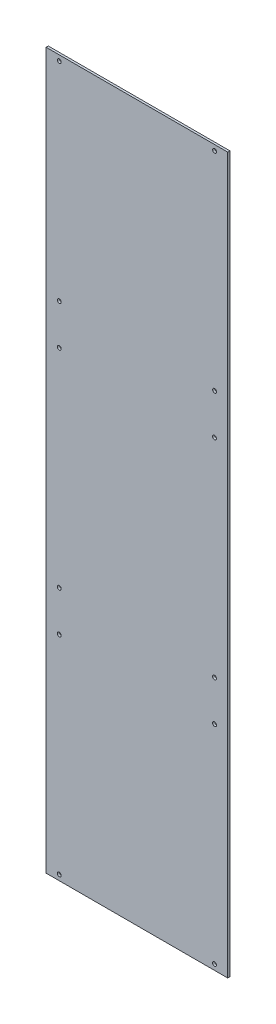
ISO-10303-21;
HEADER;
FILE_DESCRIPTION(('STEP AP214'),'2;1');
FILE_NAME('part.step','',(''),(''),'','','');
FILE_SCHEMA(('AUTOMOTIVE_DESIGN { 1 0 10303 214 1 1 1 1 }'));
ENDSEC;
DATA;
#1=APPLICATION_CONTEXT('core data for automotive mechanical design processes');
#2=APPLICATION_PROTOCOL_DEFINITION('international standard','automotive_design',2000,#1);
#3=PRODUCT_CONTEXT('',#1,'mechanical');
#4=PRODUCT('Part','Part','',(#3));
#5=PRODUCT_RELATED_PRODUCT_CATEGORY('part','',(#4));
#6=PRODUCT_DEFINITION_FORMATION('','',#4);
#7=PRODUCT_DEFINITION_CONTEXT('part definition',#1,'design');
#8=PRODUCT_DEFINITION('design','',#6,#7);
#9=PRODUCT_DEFINITION_SHAPE('','',#8);
#10=(LENGTH_UNIT() NAMED_UNIT(*) SI_UNIT(.MILLI.,.METRE.));
#11=(NAMED_UNIT(*) PLANE_ANGLE_UNIT() SI_UNIT($,.RADIAN.));
#12=(NAMED_UNIT(*) SI_UNIT($,.STERADIAN.) SOLID_ANGLE_UNIT());
#13=UNCERTAINTY_MEASURE_WITH_UNIT(LENGTH_MEASURE(1.E-05),#10,'distance_accuracy_value','');
#14=(GEOMETRIC_REPRESENTATION_CONTEXT(3) GLOBAL_UNCERTAINTY_ASSIGNED_CONTEXT((#13)) GLOBAL_UNIT_ASSIGNED_CONTEXT((#10,
#11,#12)) REPRESENTATION_CONTEXT('',''));
#15=CARTESIAN_POINT('',(0.,0.,0.));
#16=DIRECTION('',(0.,0.,1.));
#17=DIRECTION('',(1.,0.,0.));
#18=AXIS2_PLACEMENT_3D('',#15,#16,#17);
#19=CARTESIAN_POINT('',(41.5,-163.5,0.5));
#20=DIRECTION('',(-1.,0.,0.));
#21=DIRECTION('',(0.,0.,1.));
#22=AXIS2_PLACEMENT_3D('',#19,#20,#21);
#23=PLANE('',#22);
#24=DIRECTION('',(0.,1.,0.));
#25=VECTOR('',#24,1.);
#26=CARTESIAN_POINT('',(41.5,-163.5,-0.5));
#27=LINE('',#26,#25);
#28=CARTESIAN_POINT('',(41.5,-163.5,-0.5));
#29=VERTEX_POINT('',#28);
#30=CARTESIAN_POINT('',(41.5,163.5,-0.5));
#31=VERTEX_POINT('',#30);
#32=EDGE_CURVE('E95',#29,#31,#27,.T.);
#33=ORIENTED_EDGE('',*,*,#32,.T.);
#34=DIRECTION('',(0.,0.,-1.));
#35=VECTOR('',#34,1.);
#36=CARTESIAN_POINT('',(41.5,163.5,0.5));
#37=LINE('',#36,#35);
#38=CARTESIAN_POINT('',(41.5,163.5,0.5));
#39=VERTEX_POINT('',#38);
#40=EDGE_CURVE('E11',#39,#31,#37,.T.);
#41=ORIENTED_EDGE('',*,*,#40,.F.);
#42=DIRECTION('',(0.,1.,0.));
#43=VECTOR('',#42,1.);
#44=CARTESIAN_POINT('',(41.5,-163.5,0.5));
#45=LINE('',#44,#43);
#46=CARTESIAN_POINT('',(41.5,-163.5,0.5));
#47=VERTEX_POINT('',#46);
#48=EDGE_CURVE('E83',#47,#39,#45,.T.);
#49=ORIENTED_EDGE('',*,*,#48,.F.);
#50=DIRECTION('',(0.,0.,-1.));
#51=VECTOR('',#50,1.);
#52=CARTESIAN_POINT('',(41.5,-163.5,0.5));
#53=LINE('',#52,#51);
#54=EDGE_CURVE('E91',#47,#29,#53,.T.);
#55=ORIENTED_EDGE('',*,*,#54,.T.);
#56=EDGE_LOOP('',(#33,#41,#49,#55));
#57=FACE_BOUND('',#56,.T.);
#58=ADVANCED_FACE('F32',(#57),#23,.F.);
#59=CARTESIAN_POINT('',(-41.5,163.5,0.5));
#60=DIRECTION('',(0.,-1.,0.));
#61=DIRECTION('',(0.,0.,-1.));
#62=AXIS2_PLACEMENT_3D('',#59,#60,#61);
#63=PLANE('',#62);
#64=DIRECTION('',(-1.,0.,0.));
#65=VECTOR('',#64,1.);
#66=CARTESIAN_POINT('',(-41.5,163.5,-0.5));
#67=LINE('',#66,#65);
#68=CARTESIAN_POINT('',(-41.5,163.5,-0.5));
#69=VERTEX_POINT('',#68);
#70=EDGE_CURVE('E87',#31,#69,#67,.T.);
#71=ORIENTED_EDGE('',*,*,#70,.T.);
#72=DIRECTION('',(0.,0.,-1.));
#73=VECTOR('',#72,1.);
#74=CARTESIAN_POINT('',(-41.5,163.5,0.5));
#75=LINE('',#74,#73);
#76=CARTESIAN_POINT('',(-41.5,163.5,0.5));
#77=VERTEX_POINT('',#76);
#78=EDGE_CURVE('E40',#77,#69,#75,.T.);
#79=ORIENTED_EDGE('',*,*,#78,.F.);
#80=DIRECTION('',(-1.,0.,0.));
#81=VECTOR('',#80,1.);
#82=CARTESIAN_POINT('',(-41.5,163.5,0.5));
#83=LINE('',#82,#81);
#84=EDGE_CURVE('E78',#39,#77,#83,.T.);
#85=ORIENTED_EDGE('',*,*,#84,.F.);
#86=ORIENTED_EDGE('',*,*,#40,.T.);
#87=EDGE_LOOP('',(#71,#79,#85,#86));
#88=FACE_BOUND('',#87,.T.);
#89=ADVANCED_FACE('F86',(#88),#63,.F.);
#90=CARTESIAN_POINT('',(-41.5,-163.5,0.5));
#91=DIRECTION('',(1.,0.,0.));
#92=DIRECTION('',(0.,0.,-1.));
#93=AXIS2_PLACEMENT_3D('',#90,#91,#92);
#94=PLANE('',#93);
#95=DIRECTION('',(0.,-1.,0.));
#96=VECTOR('',#95,1.);
#97=CARTESIAN_POINT('',(-41.5,-163.5,-0.5));
#98=LINE('',#97,#96);
#99=CARTESIAN_POINT('',(-41.5,-163.5,-0.5));
#100=VERTEX_POINT('',#99);
#101=EDGE_CURVE('E65',#69,#100,#98,.T.);
#102=ORIENTED_EDGE('',*,*,#101,.T.);
#103=DIRECTION('',(0.,0.,-1.));
#104=VECTOR('',#103,1.);
#105=CARTESIAN_POINT('',(-41.5,-163.5,0.5));
#106=LINE('',#105,#104);
#107=CARTESIAN_POINT('',(-41.5,-163.5,0.5));
#108=VERTEX_POINT('',#107);
#109=EDGE_CURVE('E88',#108,#100,#106,.T.);
#110=ORIENTED_EDGE('',*,*,#109,.F.);
#111=DIRECTION('',(0.,-1.,0.));
#112=VECTOR('',#111,1.);
#113=CARTESIAN_POINT('',(-41.5,-163.5,0.5));
#114=LINE('',#113,#112);
#115=EDGE_CURVE('E81',#77,#108,#114,.T.);
#116=ORIENTED_EDGE('',*,*,#115,.F.);
#117=ORIENTED_EDGE('',*,*,#78,.T.);
#118=EDGE_LOOP('',(#102,#110,#116,#117));
#119=FACE_BOUND('',#118,.T.);
#120=ADVANCED_FACE('F89',(#119),#94,.F.);
#121=CARTESIAN_POINT('',(-41.5,-163.5,0.5));
#122=DIRECTION('',(0.,1.,0.));
#123=DIRECTION('',(0.,0.,1.));
#124=AXIS2_PLACEMENT_3D('',#121,#122,#123);
#125=PLANE('',#124);
#126=DIRECTION('',(1.,0.,0.));
#127=VECTOR('',#126,1.);
#128=CARTESIAN_POINT('',(-41.5,-163.5,-0.5));
#129=LINE('',#128,#127);
#130=EDGE_CURVE('E71',#100,#29,#129,.T.);
#131=ORIENTED_EDGE('',*,*,#130,.T.);
#132=ORIENTED_EDGE('',*,*,#54,.F.);
#133=DIRECTION('',(1.,0.,0.));
#134=VECTOR('',#133,1.);
#135=CARTESIAN_POINT('',(-41.5,-163.5,0.5));
#136=LINE('',#135,#134);
#137=EDGE_CURVE('E48',#108,#47,#136,.T.);
#138=ORIENTED_EDGE('',*,*,#137,.F.);
#139=ORIENTED_EDGE('',*,*,#109,.T.);
#140=EDGE_LOOP('',(#131,#132,#138,#139));
#141=FACE_BOUND('',#140,.T.);
#142=ADVANCED_FACE('F103',(#141),#125,.F.);
#143=CARTESIAN_POINT('',(0.,0.,0.5));
#144=DIRECTION('',(0.,0.,-1.));
#145=DIRECTION('',(-1.,0.,0.));
#146=AXIS2_PLACEMENT_3D('',#143,#144,#145);
#147=PLANE('',#146);
#148=CARTESIAN_POINT('',(-35.5,161.,0.500000000000001));
#149=DIRECTION('',(0.,0.,1.));
#150=DIRECTION('',(1.,0.,0.));
#151=AXIS2_PLACEMENT_3D('',#148,#149,#150);
#152=CIRCLE('',#151,0.899999999999991);
#153=CARTESIAN_POINT('',(-34.6,161.,0.500000000000001));
#154=VERTEX_POINT('',#153);
#155=EDGE_CURVE('E177',#154,#154,#152,.T.);
#156=ORIENTED_EDGE('',*,*,#155,.F.);
#157=EDGE_LOOP('',(#156));
#158=FACE_BOUND('',#157,.T.);
#159=CARTESIAN_POINT('',(35.5,161.,0.500000000000001));
#160=DIRECTION('',(0.,0.,1.));
#161=DIRECTION('',(1.,0.,0.));
#162=AXIS2_PLACEMENT_3D('',#159,#160,#161);
#163=CIRCLE('',#162,0.899999999999984);
#164=CARTESIAN_POINT('',(36.4,161.,0.500000000000001));
#165=VERTEX_POINT('',#164);
#166=EDGE_CURVE('E171',#165,#165,#163,.T.);
#167=ORIENTED_EDGE('',*,*,#166,.F.);
#168=EDGE_LOOP('',(#167));
#169=FACE_BOUND('',#168,.T.);
#170=CARTESIAN_POINT('',(-35.5,66.,0.500000000000001));
#171=DIRECTION('',(0.,0.,1.));
#172=DIRECTION('',(1.,0.,0.));
#173=AXIS2_PLACEMENT_3D('',#170,#171,#172);
#174=CIRCLE('',#173,0.899999999999991);
#175=CARTESIAN_POINT('',(-34.6,66.,0.500000000000001));
#176=VERTEX_POINT('',#175);
#177=EDGE_CURVE('E165',#176,#176,#174,.T.);
#178=ORIENTED_EDGE('',*,*,#177,.F.);
#179=EDGE_LOOP('',(#178));
#180=FACE_BOUND('',#179,.T.);
#181=CARTESIAN_POINT('',(35.5,66.,0.500000000000001));
#182=DIRECTION('',(0.,0.,1.));
#183=DIRECTION('',(1.,0.,0.));
#184=AXIS2_PLACEMENT_3D('',#181,#182,#183);
#185=CIRCLE('',#184,0.899999999999984);
#186=CARTESIAN_POINT('',(36.4,66.,0.500000000000001));
#187=VERTEX_POINT('',#186);
#188=EDGE_CURVE('E159',#187,#187,#185,.T.);
#189=ORIENTED_EDGE('',*,*,#188,.F.);
#190=EDGE_LOOP('',(#189));
#191=FACE_BOUND('',#190,.T.);
#192=CARTESIAN_POINT('',(-35.5,47.5,0.500000000000001));
#193=DIRECTION('',(0.,0.,1.));
#194=DIRECTION('',(1.,0.,0.));
#195=AXIS2_PLACEMENT_3D('',#192,#193,#194);
#196=CIRCLE('',#195,0.899999999999991);
#197=CARTESIAN_POINT('',(-34.6,47.5,0.500000000000001));
#198=VERTEX_POINT('',#197);
#199=EDGE_CURVE('E153',#198,#198,#196,.T.);
#200=ORIENTED_EDGE('',*,*,#199,.F.);
#201=EDGE_LOOP('',(#200));
#202=FACE_BOUND('',#201,.T.);
#203=CARTESIAN_POINT('',(35.5,47.5,0.500000000000001));
#204=DIRECTION('',(0.,0.,1.));
#205=DIRECTION('',(1.,0.,0.));
#206=AXIS2_PLACEMENT_3D('',#203,#204,#205);
#207=CIRCLE('',#206,0.899999999999984);
#208=CARTESIAN_POINT('',(36.4,47.5,0.500000000000001));
#209=VERTEX_POINT('',#208);
#210=EDGE_CURVE('E147',#209,#209,#207,.T.);
#211=ORIENTED_EDGE('',*,*,#210,.F.);
#212=EDGE_LOOP('',(#211));
#213=FACE_BOUND('',#212,.T.);
#214=CARTESIAN_POINT('',(-35.5,-47.5,0.500000000000001));
#215=DIRECTION('',(0.,0.,1.));
#216=DIRECTION('',(1.,0.,0.));
#217=AXIS2_PLACEMENT_3D('',#214,#215,#216);
#218=CIRCLE('',#217,0.899999999999991);
#219=CARTESIAN_POINT('',(-34.6,-47.5,0.500000000000001));
#220=VERTEX_POINT('',#219);
#221=EDGE_CURVE('E141',#220,#220,#218,.T.);
#222=ORIENTED_EDGE('',*,*,#221,.F.);
#223=EDGE_LOOP('',(#222));
#224=FACE_BOUND('',#223,.T.);
#225=CARTESIAN_POINT('',(35.5,-47.5,0.500000000000001));
#226=DIRECTION('',(0.,0.,1.));
#227=DIRECTION('',(1.,0.,0.));
#228=AXIS2_PLACEMENT_3D('',#225,#226,#227);
#229=CIRCLE('',#228,0.899999999999984);
#230=CARTESIAN_POINT('',(36.4,-47.5,0.500000000000001));
#231=VERTEX_POINT('',#230);
#232=EDGE_CURVE('E135',#231,#231,#229,.T.);
#233=ORIENTED_EDGE('',*,*,#232,.F.);
#234=EDGE_LOOP('',(#233));
#235=FACE_BOUND('',#234,.T.);
#236=CARTESIAN_POINT('',(-35.5,-66.,0.500000000000001));
#237=DIRECTION('',(0.,0.,1.));
#238=DIRECTION('',(1.,0.,0.));
#239=AXIS2_PLACEMENT_3D('',#236,#237,#238);
#240=CIRCLE('',#239,0.899999999999991);
#241=CARTESIAN_POINT('',(-34.6,-66.,0.500000000000001));
#242=VERTEX_POINT('',#241);
#243=EDGE_CURVE('E129',#242,#242,#240,.T.);
#244=ORIENTED_EDGE('',*,*,#243,.F.);
#245=EDGE_LOOP('',(#244));
#246=FACE_BOUND('',#245,.T.);
#247=CARTESIAN_POINT('',(35.5,-66.,0.500000000000001));
#248=DIRECTION('',(0.,0.,1.));
#249=DIRECTION('',(1.,0.,0.));
#250=AXIS2_PLACEMENT_3D('',#247,#248,#249);
#251=CIRCLE('',#250,0.899999999999984);
#252=CARTESIAN_POINT('',(36.4,-66.,0.500000000000001));
#253=VERTEX_POINT('',#252);
#254=EDGE_CURVE('E123',#253,#253,#251,.T.);
#255=ORIENTED_EDGE('',*,*,#254,.F.);
#256=EDGE_LOOP('',(#255));
#257=FACE_BOUND('',#256,.T.);
#258=CARTESIAN_POINT('',(-35.5,-161.,0.500000000000001));
#259=DIRECTION('',(0.,0.,1.));
#260=DIRECTION('',(1.,0.,0.));
#261=AXIS2_PLACEMENT_3D('',#258,#259,#260);
#262=CIRCLE('',#261,0.899999999999991);
#263=CARTESIAN_POINT('',(-34.6,-161.,0.500000000000001));
#264=VERTEX_POINT('',#263);
#265=EDGE_CURVE('E117',#264,#264,#262,.T.);
#266=ORIENTED_EDGE('',*,*,#265,.F.);
#267=EDGE_LOOP('',(#266));
#268=FACE_BOUND('',#267,.T.);
#269=CARTESIAN_POINT('',(35.5,-161.,0.500000000000001));
#270=DIRECTION('',(0.,0.,1.));
#271=DIRECTION('',(1.,0.,0.));
#272=AXIS2_PLACEMENT_3D('',#269,#270,#271);
#273=CIRCLE('',#272,0.899999999999984);
#274=CARTESIAN_POINT('',(36.4,-161.,0.500000000000001));
#275=VERTEX_POINT('',#274);
#276=EDGE_CURVE('E111',#275,#275,#273,.T.);
#277=ORIENTED_EDGE('',*,*,#276,.F.);
#278=EDGE_LOOP('',(#277));
#279=FACE_BOUND('',#278,.T.);
#280=ORIENTED_EDGE('',*,*,#48,.T.);
#281=ORIENTED_EDGE('',*,*,#84,.T.);
#282=ORIENTED_EDGE('',*,*,#115,.T.);
#283=ORIENTED_EDGE('',*,*,#137,.T.);
#284=EDGE_LOOP('',(#280,#281,#282,#283));
#285=FACE_BOUND('',#284,.T.);
#286=ADVANCED_FACE('F79',(#158,#169,#180,#191,#202,#213,#224,#235,#246,#257,#268,#279,#285),
#147,.F.);
#287=CARTESIAN_POINT('',(0.,0.,-0.5));
#288=DIRECTION('',(0.,0.,-1.));
#289=DIRECTION('',(-1.,0.,0.));
#290=AXIS2_PLACEMENT_3D('',#287,#288,#289);
#291=PLANE('',#290);
#292=CARTESIAN_POINT('',(-35.5,161.,-0.5));
#293=DIRECTION('',(0.,0.,1.));
#294=DIRECTION('',(1.,0.,0.));
#295=AXIS2_PLACEMENT_3D('',#292,#293,#294);
#296=CIRCLE('',#295,0.899999999999998);
#297=CARTESIAN_POINT('',(-34.6,161.,-0.5));
#298=VERTEX_POINT('',#297);
#299=EDGE_CURVE('E174',#298,#298,#296,.T.);
#300=ORIENTED_EDGE('',*,*,#299,.T.);
#301=EDGE_LOOP('',(#300));
#302=FACE_BOUND('',#301,.T.);
#303=CARTESIAN_POINT('',(35.5,161.,-0.5));
#304=DIRECTION('',(0.,0.,1.));
#305=DIRECTION('',(1.,0.,0.));
#306=AXIS2_PLACEMENT_3D('',#303,#304,#305);
#307=CIRCLE('',#306,0.899999999999998);
#308=CARTESIAN_POINT('',(36.4,161.,-0.5));
#309=VERTEX_POINT('',#308);
#310=EDGE_CURVE('E168',#309,#309,#307,.T.);
#311=ORIENTED_EDGE('',*,*,#310,.T.);
#312=EDGE_LOOP('',(#311));
#313=FACE_BOUND('',#312,.T.);
#314=CARTESIAN_POINT('',(-35.5,66.,-0.5));
#315=DIRECTION('',(0.,0.,1.));
#316=DIRECTION('',(1.,0.,0.));
#317=AXIS2_PLACEMENT_3D('',#314,#315,#316);
#318=CIRCLE('',#317,0.899999999999998);
#319=CARTESIAN_POINT('',(-34.6,66.,-0.5));
#320=VERTEX_POINT('',#319);
#321=EDGE_CURVE('E162',#320,#320,#318,.T.);
#322=ORIENTED_EDGE('',*,*,#321,.T.);
#323=EDGE_LOOP('',(#322));
#324=FACE_BOUND('',#323,.T.);
#325=CARTESIAN_POINT('',(35.5,66.,-0.5));
#326=DIRECTION('',(0.,0.,1.));
#327=DIRECTION('',(1.,0.,0.));
#328=AXIS2_PLACEMENT_3D('',#325,#326,#327);
#329=CIRCLE('',#328,0.899999999999998);
#330=CARTESIAN_POINT('',(36.4,66.,-0.5));
#331=VERTEX_POINT('',#330);
#332=EDGE_CURVE('E156',#331,#331,#329,.T.);
#333=ORIENTED_EDGE('',*,*,#332,.T.);
#334=EDGE_LOOP('',(#333));
#335=FACE_BOUND('',#334,.T.);
#336=CARTESIAN_POINT('',(-35.5,47.5,-0.5));
#337=DIRECTION('',(0.,0.,1.));
#338=DIRECTION('',(1.,0.,0.));
#339=AXIS2_PLACEMENT_3D('',#336,#337,#338);
#340=CIRCLE('',#339,0.899999999999998);
#341=CARTESIAN_POINT('',(-34.6,47.5,-0.5));
#342=VERTEX_POINT('',#341);
#343=EDGE_CURVE('E150',#342,#342,#340,.T.);
#344=ORIENTED_EDGE('',*,*,#343,.T.);
#345=EDGE_LOOP('',(#344));
#346=FACE_BOUND('',#345,.T.);
#347=CARTESIAN_POINT('',(35.5,47.5,-0.5));
#348=DIRECTION('',(0.,0.,1.));
#349=DIRECTION('',(1.,0.,0.));
#350=AXIS2_PLACEMENT_3D('',#347,#348,#349);
#351=CIRCLE('',#350,0.899999999999998);
#352=CARTESIAN_POINT('',(36.4,47.5,-0.5));
#353=VERTEX_POINT('',#352);
#354=EDGE_CURVE('E144',#353,#353,#351,.T.);
#355=ORIENTED_EDGE('',*,*,#354,.T.);
#356=EDGE_LOOP('',(#355));
#357=FACE_BOUND('',#356,.T.);
#358=CARTESIAN_POINT('',(-35.5,-47.5,-0.5));
#359=DIRECTION('',(0.,0.,1.));
#360=DIRECTION('',(1.,0.,0.));
#361=AXIS2_PLACEMENT_3D('',#358,#359,#360);
#362=CIRCLE('',#361,0.899999999999998);
#363=CARTESIAN_POINT('',(-34.6,-47.5,-0.5));
#364=VERTEX_POINT('',#363);
#365=EDGE_CURVE('E138',#364,#364,#362,.T.);
#366=ORIENTED_EDGE('',*,*,#365,.T.);
#367=EDGE_LOOP('',(#366));
#368=FACE_BOUND('',#367,.T.);
#369=CARTESIAN_POINT('',(35.5,-47.5,-0.5));
#370=DIRECTION('',(0.,0.,1.));
#371=DIRECTION('',(1.,0.,0.));
#372=AXIS2_PLACEMENT_3D('',#369,#370,#371);
#373=CIRCLE('',#372,0.899999999999998);
#374=CARTESIAN_POINT('',(36.4,-47.5,-0.5));
#375=VERTEX_POINT('',#374);
#376=EDGE_CURVE('E132',#375,#375,#373,.T.);
#377=ORIENTED_EDGE('',*,*,#376,.T.);
#378=EDGE_LOOP('',(#377));
#379=FACE_BOUND('',#378,.T.);
#380=CARTESIAN_POINT('',(-35.5,-66.,-0.5));
#381=DIRECTION('',(0.,0.,1.));
#382=DIRECTION('',(1.,0.,0.));
#383=AXIS2_PLACEMENT_3D('',#380,#381,#382);
#384=CIRCLE('',#383,0.899999999999998);
#385=CARTESIAN_POINT('',(-34.6,-66.,-0.5));
#386=VERTEX_POINT('',#385);
#387=EDGE_CURVE('E126',#386,#386,#384,.T.);
#388=ORIENTED_EDGE('',*,*,#387,.T.);
#389=EDGE_LOOP('',(#388));
#390=FACE_BOUND('',#389,.T.);
#391=CARTESIAN_POINT('',(35.5,-66.,-0.5));
#392=DIRECTION('',(0.,0.,1.));
#393=DIRECTION('',(1.,0.,0.));
#394=AXIS2_PLACEMENT_3D('',#391,#392,#393);
#395=CIRCLE('',#394,0.899999999999998);
#396=CARTESIAN_POINT('',(36.4,-66.,-0.5));
#397=VERTEX_POINT('',#396);
#398=EDGE_CURVE('E120',#397,#397,#395,.T.);
#399=ORIENTED_EDGE('',*,*,#398,.T.);
#400=EDGE_LOOP('',(#399));
#401=FACE_BOUND('',#400,.T.);
#402=CARTESIAN_POINT('',(-35.5,-161.,-0.5));
#403=DIRECTION('',(0.,0.,1.));
#404=DIRECTION('',(1.,0.,0.));
#405=AXIS2_PLACEMENT_3D('',#402,#403,#404);
#406=CIRCLE('',#405,0.899999999999998);
#407=CARTESIAN_POINT('',(-34.6,-161.,-0.5));
#408=VERTEX_POINT('',#407);
#409=EDGE_CURVE('E114',#408,#408,#406,.T.);
#410=ORIENTED_EDGE('',*,*,#409,.T.);
#411=EDGE_LOOP('',(#410));
#412=FACE_BOUND('',#411,.T.);
#413=CARTESIAN_POINT('',(35.5,-161.,-0.5));
#414=DIRECTION('',(0.,0.,1.));
#415=DIRECTION('',(1.,0.,0.));
#416=AXIS2_PLACEMENT_3D('',#413,#414,#415);
#417=CIRCLE('',#416,0.899999999999998);
#418=CARTESIAN_POINT('',(36.4,-161.,-0.5));
#419=VERTEX_POINT('',#418);
#420=EDGE_CURVE('E98',#419,#419,#417,.T.);
#421=ORIENTED_EDGE('',*,*,#420,.T.);
#422=EDGE_LOOP('',(#421));
#423=FACE_BOUND('',#422,.T.);
#424=ORIENTED_EDGE('',*,*,#32,.F.);
#425=ORIENTED_EDGE('',*,*,#130,.F.);
#426=ORIENTED_EDGE('',*,*,#101,.F.);
#427=ORIENTED_EDGE('',*,*,#70,.F.);
#428=EDGE_LOOP('',(#424,#425,#426,#427));
#429=FACE_BOUND('',#428,.T.);
#430=ADVANCED_FACE('F106',(#302,#313,#324,#335,#346,#357,#368,#379,#390,#401,#412,#423,#429),
#291,.T.);
#431=CARTESIAN_POINT('',(35.5,-161.,0.5));
#432=DIRECTION('',(0.,0.,1.));
#433=DIRECTION('',(1.,0.,0.));
#434=AXIS2_PLACEMENT_3D('',#431,#432,#433);
#435=CYLINDRICAL_SURFACE('',#434,0.899999999999991);
#436=ORIENTED_EDGE('',*,*,#420,.F.);
#437=EDGE_LOOP('',(#436));
#438=FACE_BOUND('',#437,.T.);
#439=ORIENTED_EDGE('',*,*,#276,.T.);
#440=EDGE_LOOP('',(#439));
#441=FACE_BOUND('',#440,.T.);
#442=ADVANCED_FACE('F208',(#438,#441),#435,.F.);
#443=CARTESIAN_POINT('',(-35.5,-161.,0.5));
#444=DIRECTION('',(0.,0.,1.));
#445=DIRECTION('',(1.,0.,0.));
#446=AXIS2_PLACEMENT_3D('',#443,#444,#445);
#447=CYLINDRICAL_SURFACE('',#446,0.899999999999995);
#448=ORIENTED_EDGE('',*,*,#409,.F.);
#449=EDGE_LOOP('',(#448));
#450=FACE_BOUND('',#449,.T.);
#451=ORIENTED_EDGE('',*,*,#265,.T.);
#452=EDGE_LOOP('',(#451));
#453=FACE_BOUND('',#452,.T.);
#454=ADVANCED_FACE('F210',(#450,#453),#447,.F.);
#455=CARTESIAN_POINT('',(35.5,-66.,0.5));
#456=DIRECTION('',(0.,0.,1.));
#457=DIRECTION('',(1.,0.,0.));
#458=AXIS2_PLACEMENT_3D('',#455,#456,#457);
#459=CYLINDRICAL_SURFACE('',#458,0.899999999999991);
#460=ORIENTED_EDGE('',*,*,#398,.F.);
#461=EDGE_LOOP('',(#460));
#462=FACE_BOUND('',#461,.T.);
#463=ORIENTED_EDGE('',*,*,#254,.T.);
#464=EDGE_LOOP('',(#463));
#465=FACE_BOUND('',#464,.T.);
#466=ADVANCED_FACE('F217',(#462,#465),#459,.F.);
#467=CARTESIAN_POINT('',(-35.5,-66.,0.5));
#468=DIRECTION('',(0.,0.,1.));
#469=DIRECTION('',(1.,0.,0.));
#470=AXIS2_PLACEMENT_3D('',#467,#468,#469);
#471=CYLINDRICAL_SURFACE('',#470,0.899999999999995);
#472=ORIENTED_EDGE('',*,*,#387,.F.);
#473=EDGE_LOOP('',(#472));
#474=FACE_BOUND('',#473,.T.);
#475=ORIENTED_EDGE('',*,*,#243,.T.);
#476=EDGE_LOOP('',(#475));
#477=FACE_BOUND('',#476,.T.);
#478=ADVANCED_FACE('F264',(#474,#477),#471,.F.);
#479=CARTESIAN_POINT('',(35.5,-47.5,0.5));
#480=DIRECTION('',(0.,0.,1.));
#481=DIRECTION('',(1.,0.,0.));
#482=AXIS2_PLACEMENT_3D('',#479,#480,#481);
#483=CYLINDRICAL_SURFACE('',#482,0.899999999999991);
#484=ORIENTED_EDGE('',*,*,#376,.F.);
#485=EDGE_LOOP('',(#484));
#486=FACE_BOUND('',#485,.T.);
#487=ORIENTED_EDGE('',*,*,#232,.T.);
#488=EDGE_LOOP('',(#487));
#489=FACE_BOUND('',#488,.T.);
#490=ADVANCED_FACE('F274',(#486,#489),#483,.F.);
#491=CARTESIAN_POINT('',(-35.5,-47.5,0.5));
#492=DIRECTION('',(0.,0.,1.));
#493=DIRECTION('',(1.,0.,0.));
#494=AXIS2_PLACEMENT_3D('',#491,#492,#493);
#495=CYLINDRICAL_SURFACE('',#494,0.899999999999995);
#496=ORIENTED_EDGE('',*,*,#365,.F.);
#497=EDGE_LOOP('',(#496));
#498=FACE_BOUND('',#497,.T.);
#499=ORIENTED_EDGE('',*,*,#221,.T.);
#500=EDGE_LOOP('',(#499));
#501=FACE_BOUND('',#500,.T.);
#502=ADVANCED_FACE('F284',(#498,#501),#495,.F.);
#503=CARTESIAN_POINT('',(35.5,47.5,0.5));
#504=DIRECTION('',(0.,0.,1.));
#505=DIRECTION('',(1.,0.,0.));
#506=AXIS2_PLACEMENT_3D('',#503,#504,#505);
#507=CYLINDRICAL_SURFACE('',#506,0.899999999999991);
#508=ORIENTED_EDGE('',*,*,#354,.F.);
#509=EDGE_LOOP('',(#508));
#510=FACE_BOUND('',#509,.T.);
#511=ORIENTED_EDGE('',*,*,#210,.T.);
#512=EDGE_LOOP('',(#511));
#513=FACE_BOUND('',#512,.T.);
#514=ADVANCED_FACE('F294',(#510,#513),#507,.F.);
#515=CARTESIAN_POINT('',(-35.5,47.5,0.5));
#516=DIRECTION('',(0.,0.,1.));
#517=DIRECTION('',(1.,0.,0.));
#518=AXIS2_PLACEMENT_3D('',#515,#516,#517);
#519=CYLINDRICAL_SURFACE('',#518,0.899999999999995);
#520=ORIENTED_EDGE('',*,*,#343,.F.);
#521=EDGE_LOOP('',(#520));
#522=FACE_BOUND('',#521,.T.);
#523=ORIENTED_EDGE('',*,*,#199,.T.);
#524=EDGE_LOOP('',(#523));
#525=FACE_BOUND('',#524,.T.);
#526=ADVANCED_FACE('F304',(#522,#525),#519,.F.);
#527=CARTESIAN_POINT('',(35.5,66.,0.5));
#528=DIRECTION('',(0.,0.,1.));
#529=DIRECTION('',(1.,0.,0.));
#530=AXIS2_PLACEMENT_3D('',#527,#528,#529);
#531=CYLINDRICAL_SURFACE('',#530,0.899999999999991);
#532=ORIENTED_EDGE('',*,*,#332,.F.);
#533=EDGE_LOOP('',(#532));
#534=FACE_BOUND('',#533,.T.);
#535=ORIENTED_EDGE('',*,*,#188,.T.);
#536=EDGE_LOOP('',(#535));
#537=FACE_BOUND('',#536,.T.);
#538=ADVANCED_FACE('F314',(#534,#537),#531,.F.);
#539=CARTESIAN_POINT('',(-35.5,66.,0.5));
#540=DIRECTION('',(0.,0.,1.));
#541=DIRECTION('',(1.,0.,0.));
#542=AXIS2_PLACEMENT_3D('',#539,#540,#541);
#543=CYLINDRICAL_SURFACE('',#542,0.899999999999995);
#544=ORIENTED_EDGE('',*,*,#321,.F.);
#545=EDGE_LOOP('',(#544));
#546=FACE_BOUND('',#545,.T.);
#547=ORIENTED_EDGE('',*,*,#177,.T.);
#548=EDGE_LOOP('',(#547));
#549=FACE_BOUND('',#548,.T.);
#550=ADVANCED_FACE('F324',(#546,#549),#543,.F.);
#551=CARTESIAN_POINT('',(35.5,161.,0.5));
#552=DIRECTION('',(0.,0.,1.));
#553=DIRECTION('',(1.,0.,0.));
#554=AXIS2_PLACEMENT_3D('',#551,#552,#553);
#555=CYLINDRICAL_SURFACE('',#554,0.899999999999991);
#556=ORIENTED_EDGE('',*,*,#310,.F.);
#557=EDGE_LOOP('',(#556));
#558=FACE_BOUND('',#557,.T.);
#559=ORIENTED_EDGE('',*,*,#166,.T.);
#560=EDGE_LOOP('',(#559));
#561=FACE_BOUND('',#560,.T.);
#562=ADVANCED_FACE('F334',(#558,#561),#555,.F.);
#563=CARTESIAN_POINT('',(-35.5,161.,0.5));
#564=DIRECTION('',(0.,0.,1.));
#565=DIRECTION('',(1.,0.,0.));
#566=AXIS2_PLACEMENT_3D('',#563,#564,#565);
#567=CYLINDRICAL_SURFACE('',#566,0.899999999999995);
#568=ORIENTED_EDGE('',*,*,#299,.F.);
#569=EDGE_LOOP('',(#568));
#570=FACE_BOUND('',#569,.T.);
#571=ORIENTED_EDGE('',*,*,#155,.T.);
#572=EDGE_LOOP('',(#571));
#573=FACE_BOUND('',#572,.T.);
#574=ADVANCED_FACE('F181',(#570,#573),#567,.F.);
#575=CLOSED_SHELL('',(#58,#89,#120,#142,#286,#430,#442,#454,#466,#478,#490,#502,#514,#526,#538,
#550,#562,#574));
#576=MANIFOLD_SOLID_BREP('B2',#575);
#577=ADVANCED_BREP_SHAPE_REPRESENTATION('',(#18,#576),#14);
#578=SHAPE_DEFINITION_REPRESENTATION(#9,#577);
ENDSEC;
END-ISO-10303-21;
